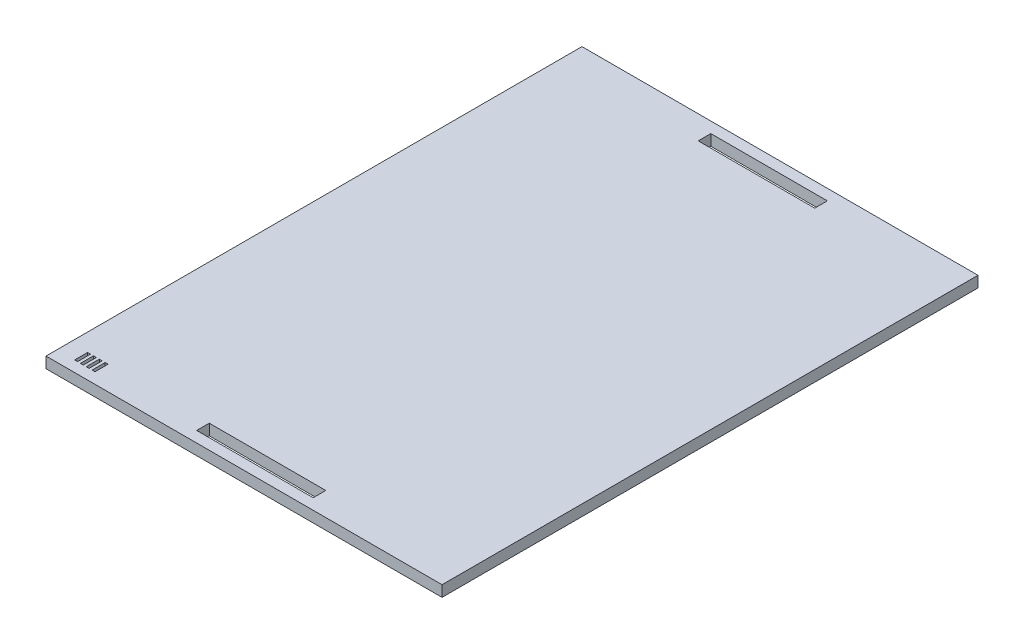
ISO-10303-21;
HEADER;
FILE_DESCRIPTION(('STEP AP214'),'2;1');
FILE_NAME('part.step','',(''),(''),'','','');
FILE_SCHEMA(('AUTOMOTIVE_DESIGN { 1 0 10303 214 1 1 1 1 }'));
ENDSEC;
DATA;
#1=APPLICATION_CONTEXT('core data for automotive mechanical design processes');
#2=APPLICATION_PROTOCOL_DEFINITION('international standard','automotive_design',2000,#1);
#3=PRODUCT_CONTEXT('',#1,'mechanical');
#4=PRODUCT('Part','Part','',(#3));
#5=PRODUCT_RELATED_PRODUCT_CATEGORY('part','',(#4));
#6=PRODUCT_DEFINITION_FORMATION('','',#4);
#7=PRODUCT_DEFINITION_CONTEXT('part definition',#1,'design');
#8=PRODUCT_DEFINITION('design','',#6,#7);
#9=PRODUCT_DEFINITION_SHAPE('','',#8);
#10=(LENGTH_UNIT() NAMED_UNIT(*) SI_UNIT(.MILLI.,.METRE.));
#11=(NAMED_UNIT(*) PLANE_ANGLE_UNIT() SI_UNIT($,.RADIAN.));
#12=(NAMED_UNIT(*) SI_UNIT($,.STERADIAN.) SOLID_ANGLE_UNIT());
#13=UNCERTAINTY_MEASURE_WITH_UNIT(LENGTH_MEASURE(1.E-05),#10,'distance_accuracy_value','');
#14=(GEOMETRIC_REPRESENTATION_CONTEXT(3) GLOBAL_UNCERTAINTY_ASSIGNED_CONTEXT((#13)) GLOBAL_UNIT_ASSIGNED_CONTEXT((#10,
#11,#12)) REPRESENTATION_CONTEXT('',''));
#15=CARTESIAN_POINT('',(0.,0.,0.));
#16=DIRECTION('',(0.,0.,1.));
#17=DIRECTION('',(1.,0.,0.));
#18=AXIS2_PLACEMENT_3D('',#15,#16,#17);
#19=CARTESIAN_POINT('',(0.,2.9972,66.4972));
#20=DIRECTION('',(0.,0.,-1.));
#21=DIRECTION('',(-1.,0.,0.));
#22=AXIS2_PLACEMENT_3D('',#19,#20,#21);
#23=PLANE('',#22);
#24=DIRECTION('',(1.,0.,0.));
#25=VECTOR('',#24,1.);
#26=CARTESIAN_POINT('',(0.,0.,66.4972));
#27=LINE('',#26,#25);
#28=CARTESIAN_POINT('',(-44.3760396173912,0.,66.4972));
#29=VERTEX_POINT('',#28);
#30=CARTESIAN_POINT('',(-43.5822896173912,0.,66.4972));
#31=VERTEX_POINT('',#30);
#32=EDGE_CURVE('E357',#29,#31,#27,.T.);
#33=ORIENTED_EDGE('',*,*,#32,.T.);
#34=DIRECTION('',(0.,-1.,0.));
#35=VECTOR('',#34,1.);
#36=CARTESIAN_POINT('',(-43.5822896173912,2.9972,66.4972));
#37=LINE('',#36,#35);
#38=CARTESIAN_POINT('',(-43.5822896173912,2.9972,66.4972));
#39=VERTEX_POINT('',#38);
#40=EDGE_CURVE('E11',#39,#31,#37,.T.);
#41=ORIENTED_EDGE('',*,*,#40,.F.);
#42=DIRECTION('',(1.,0.,0.));
#43=VECTOR('',#42,1.);
#44=CARTESIAN_POINT('',(0.,2.9972,66.4972));
#45=LINE('',#44,#43);
#46=CARTESIAN_POINT('',(-44.3760396173912,2.9972,66.4972));
#47=VERTEX_POINT('',#46);
#48=EDGE_CURVE('E241',#47,#39,#45,.T.);
#49=ORIENTED_EDGE('',*,*,#48,.F.);
#50=DIRECTION('',(0.,-1.,0.));
#51=VECTOR('',#50,1.);
#52=CARTESIAN_POINT('',(-44.3760396173912,2.9972,66.4972));
#53=LINE('',#52,#51);
#54=EDGE_CURVE('E61',#47,#29,#53,.T.);
#55=ORIENTED_EDGE('',*,*,#54,.T.);
#56=EDGE_LOOP('',(#33,#41,#49,#55));
#57=FACE_BOUND('',#56,.T.);
#58=ADVANCED_FACE('F41',(#57),#23,.F.);
#59=CARTESIAN_POINT('',(-43.5822896173912,2.9972,0.));
#60=DIRECTION('',(1.,0.,0.));
#61=DIRECTION('',(0.,0.,-1.));
#62=AXIS2_PLACEMENT_3D('',#59,#60,#61);
#63=PLANE('',#62);
#64=DIRECTION('',(0.,0.,1.));
#65=VECTOR('',#64,1.);
#66=CARTESIAN_POINT('',(-43.5822896173912,0.,0.));
#67=LINE('',#66,#65);
#68=CARTESIAN_POINT('',(-43.5822896173912,0.,70.0532));
#69=VERTEX_POINT('',#68);
#70=EDGE_CURVE('E248',#31,#69,#67,.T.);
#71=ORIENTED_EDGE('',*,*,#70,.T.);
#72=DIRECTION('',(0.,-1.,0.));
#73=VECTOR('',#72,1.);
#74=CARTESIAN_POINT('',(-43.5822896173912,2.9972,70.0532));
#75=LINE('',#74,#73);
#76=CARTESIAN_POINT('',(-43.5822896173912,2.9972,70.0532));
#77=VERTEX_POINT('',#76);
#78=EDGE_CURVE('E52',#77,#69,#75,.T.);
#79=ORIENTED_EDGE('',*,*,#78,.F.);
#80=DIRECTION('',(0.,0.,1.));
#81=VECTOR('',#80,1.);
#82=CARTESIAN_POINT('',(-43.5822896173912,2.9972,0.));
#83=LINE('',#82,#81);
#84=EDGE_CURVE('E235',#39,#77,#83,.T.);
#85=ORIENTED_EDGE('',*,*,#84,.F.);
#86=ORIENTED_EDGE('',*,*,#40,.T.);
#87=EDGE_LOOP('',(#71,#79,#85,#86));
#88=FACE_BOUND('',#87,.T.);
#89=ADVANCED_FACE('F247',(#88),#63,.F.);
#90=CARTESIAN_POINT('',(0.,2.9972,70.0532));
#91=DIRECTION('',(0.,0.,-1.));
#92=DIRECTION('',(-1.,0.,0.));
#93=AXIS2_PLACEMENT_3D('',#90,#91,#92);
#94=PLANE('',#93);
#95=DIRECTION('',(1.,0.,0.));
#96=VECTOR('',#95,1.);
#97=CARTESIAN_POINT('',(0.,0.,70.0532));
#98=LINE('',#97,#96);
#99=CARTESIAN_POINT('',(-44.3760396173912,0.,70.0532));
#100=VERTEX_POINT('',#99);
#101=EDGE_CURVE('E362',#100,#69,#98,.T.);
#102=ORIENTED_EDGE('',*,*,#101,.F.);
#103=DIRECTION('',(0.,-1.,0.));
#104=VECTOR('',#103,1.);
#105=CARTESIAN_POINT('',(-44.3760396173912,2.9972,70.0532));
#106=LINE('',#105,#104);
#107=CARTESIAN_POINT('',(-44.3760396173912,2.9972,70.0532));
#108=VERTEX_POINT('',#107);
#109=EDGE_CURVE('E147',#108,#100,#106,.T.);
#110=ORIENTED_EDGE('',*,*,#109,.F.);
#111=DIRECTION('',(1.,0.,0.));
#112=VECTOR('',#111,1.);
#113=CARTESIAN_POINT('',(0.,2.9972,70.0532));
#114=LINE('',#113,#112);
#115=EDGE_CURVE('E240',#108,#77,#114,.T.);
#116=ORIENTED_EDGE('',*,*,#115,.T.);
#117=ORIENTED_EDGE('',*,*,#78,.T.);
#118=EDGE_LOOP('',(#102,#110,#116,#117));
#119=FACE_BOUND('',#118,.T.);
#120=ADVANCED_FACE('F253',(#119),#94,.T.);
#121=CARTESIAN_POINT('',(0.,2.9972,66.4972));
#122=DIRECTION('',(0.,0.,-1.));
#123=DIRECTION('',(-1.,0.,0.));
#124=AXIS2_PLACEMENT_3D('',#121,#122,#123);
#125=PLANE('',#124);
#126=DIRECTION('',(1.,0.,0.));
#127=VECTOR('',#126,1.);
#128=CARTESIAN_POINT('',(0.,0.,66.4972));
#129=LINE('',#128,#127);
#130=CARTESIAN_POINT('',(-45.9635396173912,0.,66.4972));
#131=VERTEX_POINT('',#130);
#132=CARTESIAN_POINT('',(-45.1697896173912,0.,66.4972));
#133=VERTEX_POINT('',#132);
#134=EDGE_CURVE('E341',#131,#133,#129,.T.);
#135=ORIENTED_EDGE('',*,*,#134,.T.);
#136=DIRECTION('',(0.,-1.,0.));
#137=VECTOR('',#136,1.);
#138=CARTESIAN_POINT('',(-45.1697896173912,2.9972,66.4972));
#139=LINE('',#138,#137);
#140=CARTESIAN_POINT('',(-45.1697896173912,2.9972,66.4972));
#141=VERTEX_POINT('',#140);
#142=EDGE_CURVE('E372',#141,#133,#139,.T.);
#143=ORIENTED_EDGE('',*,*,#142,.F.);
#144=DIRECTION('',(1.,0.,0.));
#145=VECTOR('',#144,1.);
#146=CARTESIAN_POINT('',(0.,2.9972,66.4972));
#147=LINE('',#146,#145);
#148=CARTESIAN_POINT('',(-45.9635396173912,2.9972,66.4972));
#149=VERTEX_POINT('',#148);
#150=EDGE_CURVE('E535',#149,#141,#147,.T.);
#151=ORIENTED_EDGE('',*,*,#150,.F.);
#152=DIRECTION('',(0.,-1.,0.));
#153=VECTOR('',#152,1.);
#154=CARTESIAN_POINT('',(-45.9635396173912,2.9972,66.4972));
#155=LINE('',#154,#153);
#156=EDGE_CURVE('E375',#149,#131,#155,.T.);
#157=ORIENTED_EDGE('',*,*,#156,.T.);
#158=EDGE_LOOP('',(#135,#143,#151,#157));
#159=FACE_BOUND('',#158,.T.);
#160=ADVANCED_FACE('F566',(#159),#125,.F.);
#161=CARTESIAN_POINT('',(-45.1697896173912,2.9972,0.));
#162=DIRECTION('',(1.,0.,0.));
#163=DIRECTION('',(0.,0.,-1.));
#164=AXIS2_PLACEMENT_3D('',#161,#162,#163);
#165=PLANE('',#164);
#166=DIRECTION('',(0.,0.,1.));
#167=VECTOR('',#166,1.);
#168=CARTESIAN_POINT('',(-45.1697896173912,0.,0.));
#169=LINE('',#168,#167);
#170=CARTESIAN_POINT('',(-45.1697896173912,0.,70.0532));
#171=VERTEX_POINT('',#170);
#172=EDGE_CURVE('E345',#133,#171,#169,.T.);
#173=ORIENTED_EDGE('',*,*,#172,.T.);
#174=DIRECTION('',(0.,-1.,0.));
#175=VECTOR('',#174,1.);
#176=CARTESIAN_POINT('',(-45.1697896173912,2.9972,70.0532));
#177=LINE('',#176,#175);
#178=CARTESIAN_POINT('',(-45.1697896173912,2.9972,70.0532));
#179=VERTEX_POINT('',#178);
#180=EDGE_CURVE('E382',#179,#171,#177,.T.);
#181=ORIENTED_EDGE('',*,*,#180,.F.);
#182=DIRECTION('',(0.,0.,1.));
#183=VECTOR('',#182,1.);
#184=CARTESIAN_POINT('',(-45.1697896173912,2.9972,0.));
#185=LINE('',#184,#183);
#186=EDGE_CURVE('E539',#141,#179,#185,.T.);
#187=ORIENTED_EDGE('',*,*,#186,.F.);
#188=ORIENTED_EDGE('',*,*,#142,.T.);
#189=EDGE_LOOP('',(#173,#181,#187,#188));
#190=FACE_BOUND('',#189,.T.);
#191=ADVANCED_FACE('F568',(#190),#165,.F.);
#192=CARTESIAN_POINT('',(0.,2.9972,70.0532));
#193=DIRECTION('',(0.,0.,-1.));
#194=DIRECTION('',(-1.,0.,0.));
#195=AXIS2_PLACEMENT_3D('',#192,#193,#194);
#196=PLANE('',#195);
#197=DIRECTION('',(1.,0.,0.));
#198=VECTOR('',#197,1.);
#199=CARTESIAN_POINT('',(0.,0.,70.0532));
#200=LINE('',#199,#198);
#201=CARTESIAN_POINT('',(-45.9635396173912,0.,70.0532));
#202=VERTEX_POINT('',#201);
#203=EDGE_CURVE('E349',#202,#171,#200,.T.);
#204=ORIENTED_EDGE('',*,*,#203,.F.);
#205=DIRECTION('',(0.,-1.,0.));
#206=VECTOR('',#205,1.);
#207=CARTESIAN_POINT('',(-45.9635396173912,2.9972,70.0532));
#208=LINE('',#207,#206);
#209=CARTESIAN_POINT('',(-45.9635396173912,2.9972,70.0532));
#210=VERTEX_POINT('',#209);
#211=EDGE_CURVE('E378',#210,#202,#208,.T.);
#212=ORIENTED_EDGE('',*,*,#211,.F.);
#213=DIRECTION('',(1.,0.,0.));
#214=VECTOR('',#213,1.);
#215=CARTESIAN_POINT('',(0.,2.9972,70.0532));
#216=LINE('',#215,#214);
#217=EDGE_CURVE('E542',#210,#179,#216,.T.);
#218=ORIENTED_EDGE('',*,*,#217,.T.);
#219=ORIENTED_EDGE('',*,*,#180,.T.);
#220=EDGE_LOOP('',(#204,#212,#218,#219));
#221=FACE_BOUND('',#220,.T.);
#222=ADVANCED_FACE('F561',(#221),#196,.T.);
#223=CARTESIAN_POINT('',(0.,2.9972,66.4972));
#224=DIRECTION('',(0.,0.,-1.));
#225=DIRECTION('',(-1.,0.,0.));
#226=AXIS2_PLACEMENT_3D('',#223,#224,#225);
#227=PLANE('',#226);
#228=DIRECTION('',(1.,0.,0.));
#229=VECTOR('',#228,1.);
#230=CARTESIAN_POINT('',(0.,0.,66.4972));
#231=LINE('',#230,#229);
#232=CARTESIAN_POINT('',(-49.1385396173912,0.,66.4972));
#233=VERTEX_POINT('',#232);
#234=CARTESIAN_POINT('',(-48.3447896173912,0.,66.4972));
#235=VERTEX_POINT('',#234);
#236=EDGE_CURVE('E325',#233,#235,#231,.T.);
#237=ORIENTED_EDGE('',*,*,#236,.T.);
#238=DIRECTION('',(0.,-1.,0.));
#239=VECTOR('',#238,1.);
#240=CARTESIAN_POINT('',(-48.3447896173912,2.9972,66.4972));
#241=LINE('',#240,#239);
#242=CARTESIAN_POINT('',(-48.3447896173912,2.9972,66.4972));
#243=VERTEX_POINT('',#242);
#244=EDGE_CURVE('E379',#243,#235,#241,.T.);
#245=ORIENTED_EDGE('',*,*,#244,.F.);
#246=DIRECTION('',(1.,0.,0.));
#247=VECTOR('',#246,1.);
#248=CARTESIAN_POINT('',(0.,2.9972,66.4972));
#249=LINE('',#248,#247);
#250=CARTESIAN_POINT('',(-49.1385396173912,2.9972,66.4972));
#251=VERTEX_POINT('',#250);
#252=EDGE_CURVE('E520',#251,#243,#249,.T.);
#253=ORIENTED_EDGE('',*,*,#252,.F.);
#254=DIRECTION('',(0.,-1.,0.));
#255=VECTOR('',#254,1.);
#256=CARTESIAN_POINT('',(-49.1385396173912,2.9972,66.4972));
#257=LINE('',#256,#255);
#258=EDGE_CURVE('E388',#251,#233,#257,.T.);
#259=ORIENTED_EDGE('',*,*,#258,.T.);
#260=EDGE_LOOP('',(#237,#245,#253,#259));
#261=FACE_BOUND('',#260,.T.);
#262=ADVANCED_FACE('F575',(#261),#227,.F.);
#263=CARTESIAN_POINT('',(-48.3447896173912,2.9972,0.));
#264=DIRECTION('',(1.,0.,0.));
#265=DIRECTION('',(0.,0.,-1.));
#266=AXIS2_PLACEMENT_3D('',#263,#264,#265);
#267=PLANE('',#266);
#268=DIRECTION('',(0.,0.,1.));
#269=VECTOR('',#268,1.);
#270=CARTESIAN_POINT('',(-48.3447896173912,0.,0.));
#271=LINE('',#270,#269);
#272=CARTESIAN_POINT('',(-48.3447896173912,0.,70.0532));
#273=VERTEX_POINT('',#272);
#274=EDGE_CURVE('E329',#235,#273,#271,.T.);
#275=ORIENTED_EDGE('',*,*,#274,.T.);
#276=DIRECTION('',(0.,-1.,0.));
#277=VECTOR('',#276,1.);
#278=CARTESIAN_POINT('',(-48.3447896173912,2.9972,70.0532));
#279=LINE('',#278,#277);
#280=CARTESIAN_POINT('',(-48.3447896173912,2.9972,70.0532));
#281=VERTEX_POINT('',#280);
#282=EDGE_CURVE('E395',#281,#273,#279,.T.);
#283=ORIENTED_EDGE('',*,*,#282,.F.);
#284=DIRECTION('',(0.,0.,1.));
#285=VECTOR('',#284,1.);
#286=CARTESIAN_POINT('',(-48.3447896173912,2.9972,0.));
#287=LINE('',#286,#285);
#288=EDGE_CURVE('E524',#243,#281,#287,.T.);
#289=ORIENTED_EDGE('',*,*,#288,.F.);
#290=ORIENTED_EDGE('',*,*,#244,.T.);
#291=EDGE_LOOP('',(#275,#283,#289,#290));
#292=FACE_BOUND('',#291,.T.);
#293=ADVANCED_FACE('F653',(#292),#267,.F.);
#294=CARTESIAN_POINT('',(0.,2.9972,70.0532));
#295=DIRECTION('',(0.,0.,-1.));
#296=DIRECTION('',(-1.,0.,0.));
#297=AXIS2_PLACEMENT_3D('',#294,#295,#296);
#298=PLANE('',#297);
#299=DIRECTION('',(1.,0.,0.));
#300=VECTOR('',#299,1.);
#301=CARTESIAN_POINT('',(0.,0.,70.0532));
#302=LINE('',#301,#300);
#303=CARTESIAN_POINT('',(-49.1385396173912,0.,70.0532));
#304=VERTEX_POINT('',#303);
#305=EDGE_CURVE('E333',#304,#273,#302,.T.);
#306=ORIENTED_EDGE('',*,*,#305,.F.);
#307=DIRECTION('',(0.,-1.,0.));
#308=VECTOR('',#307,1.);
#309=CARTESIAN_POINT('',(-49.1385396173912,2.9972,70.0532));
#310=LINE('',#309,#308);
#311=CARTESIAN_POINT('',(-49.1385396173912,2.9972,70.0532));
#312=VERTEX_POINT('',#311);
#313=EDGE_CURVE('E391',#312,#304,#310,.T.);
#314=ORIENTED_EDGE('',*,*,#313,.F.);
#315=DIRECTION('',(1.,0.,0.));
#316=VECTOR('',#315,1.);
#317=CARTESIAN_POINT('',(0.,2.9972,70.0532));
#318=LINE('',#317,#316);
#319=EDGE_CURVE('E527',#312,#281,#318,.T.);
#320=ORIENTED_EDGE('',*,*,#319,.T.);
#321=ORIENTED_EDGE('',*,*,#282,.T.);
#322=EDGE_LOOP('',(#306,#314,#320,#321));
#323=FACE_BOUND('',#322,.T.);
#324=ADVANCED_FACE('F640',(#323),#298,.T.);
#325=CARTESIAN_POINT('',(0.,2.9972,66.6242));
#326=DIRECTION('',(0.,0.,-1.));
#327=DIRECTION('',(-1.,0.,0.));
#328=AXIS2_PLACEMENT_3D('',#325,#326,#327);
#329=PLANE('',#328);
#330=DIRECTION('',(1.,0.,0.));
#331=VECTOR('',#330,1.);
#332=CARTESIAN_POINT('',(0.,0.,66.6242));
#333=LINE('',#332,#331);
#334=CARTESIAN_POINT('',(-15.875,0.,66.6242));
#335=VERTEX_POINT('',#334);
#336=CARTESIAN_POINT('',(15.875,0.,66.6242));
#337=VERTEX_POINT('',#336);
#338=EDGE_CURVE('E309',#335,#337,#333,.T.);
#339=ORIENTED_EDGE('',*,*,#338,.T.);
#340=DIRECTION('',(0.,-1.,0.));
#341=VECTOR('',#340,1.);
#342=CARTESIAN_POINT('',(15.875,2.9972,66.6242));
#343=LINE('',#342,#341);
#344=CARTESIAN_POINT('',(15.875,2.9972,66.6242));
#345=VERTEX_POINT('',#344);
#346=EDGE_CURVE('E392',#345,#337,#343,.T.);
#347=ORIENTED_EDGE('',*,*,#346,.F.);
#348=DIRECTION('',(1.,0.,0.));
#349=VECTOR('',#348,1.);
#350=CARTESIAN_POINT('',(0.,2.9972,66.6242));
#351=LINE('',#350,#349);
#352=CARTESIAN_POINT('',(-15.875,2.9972,66.6242));
#353=VERTEX_POINT('',#352);
#354=EDGE_CURVE('E505',#353,#345,#351,.T.);
#355=ORIENTED_EDGE('',*,*,#354,.F.);
#356=DIRECTION('',(0.,-1.,0.));
#357=VECTOR('',#356,1.);
#358=CARTESIAN_POINT('',(-15.875,2.9972,66.6242));
#359=LINE('',#358,#357);
#360=EDGE_CURVE('E401',#353,#335,#359,.T.);
#361=ORIENTED_EDGE('',*,*,#360,.T.);
#362=EDGE_LOOP('',(#339,#347,#355,#361));
#363=FACE_BOUND('',#362,.T.);
#364=ADVANCED_FACE('F636',(#363),#329,.F.);
#365=CARTESIAN_POINT('',(15.8750000000001,2.9972,0.));
#366=DIRECTION('',(1.,0.,0.));
#367=DIRECTION('',(0.,0.,-1.));
#368=AXIS2_PLACEMENT_3D('',#365,#366,#367);
#369=PLANE('',#368);
#370=DIRECTION('',(0.,0.,1.));
#371=VECTOR('',#370,1.);
#372=CARTESIAN_POINT('',(15.8750000000001,0.,0.));
#373=LINE('',#372,#371);
#374=CARTESIAN_POINT('',(15.875,0.,70.0532));
#375=VERTEX_POINT('',#374);
#376=EDGE_CURVE('E313',#337,#375,#373,.T.);
#377=ORIENTED_EDGE('',*,*,#376,.T.);
#378=DIRECTION('',(0.,-1.,0.));
#379=VECTOR('',#378,1.);
#380=CARTESIAN_POINT('',(15.875,2.9972,70.0532));
#381=LINE('',#380,#379);
#382=CARTESIAN_POINT('',(15.875,2.9972,70.0532));
#383=VERTEX_POINT('',#382);
#384=EDGE_CURVE('E408',#383,#375,#381,.T.);
#385=ORIENTED_EDGE('',*,*,#384,.F.);
#386=DIRECTION('',(0.,0.,1.));
#387=VECTOR('',#386,1.);
#388=CARTESIAN_POINT('',(15.8750000000001,2.9972,0.));
#389=LINE('',#388,#387);
#390=EDGE_CURVE('E509',#345,#383,#389,.T.);
#391=ORIENTED_EDGE('',*,*,#390,.F.);
#392=ORIENTED_EDGE('',*,*,#346,.T.);
#393=EDGE_LOOP('',(#377,#385,#391,#392));
#394=FACE_BOUND('',#393,.T.);
#395=ADVANCED_FACE('F639',(#394),#369,.F.);
#396=CARTESIAN_POINT('',(0.,2.9972,70.0532));
#397=DIRECTION('',(0.,0.,-1.));
#398=DIRECTION('',(-1.,0.,0.));
#399=AXIS2_PLACEMENT_3D('',#396,#397,#398);
#400=PLANE('',#399);
#401=DIRECTION('',(1.,0.,0.));
#402=VECTOR('',#401,1.);
#403=CARTESIAN_POINT('',(0.,0.,70.0532));
#404=LINE('',#403,#402);
#405=CARTESIAN_POINT('',(-15.875,0.,70.0532));
#406=VERTEX_POINT('',#405);
#407=EDGE_CURVE('E317',#406,#375,#404,.T.);
#408=ORIENTED_EDGE('',*,*,#407,.F.);
#409=DIRECTION('',(0.,-1.,0.));
#410=VECTOR('',#409,1.);
#411=CARTESIAN_POINT('',(-15.875,2.9972,70.0532));
#412=LINE('',#411,#410);
#413=CARTESIAN_POINT('',(-15.875,2.9972,70.0532));
#414=VERTEX_POINT('',#413);
#415=EDGE_CURVE('E404',#414,#406,#412,.T.);
#416=ORIENTED_EDGE('',*,*,#415,.F.);
#417=DIRECTION('',(1.,0.,0.));
#418=VECTOR('',#417,1.);
#419=CARTESIAN_POINT('',(0.,2.9972,70.0532));
#420=LINE('',#419,#418);
#421=EDGE_CURVE('E512',#414,#383,#420,.T.);
#422=ORIENTED_EDGE('',*,*,#421,.T.);
#423=ORIENTED_EDGE('',*,*,#384,.T.);
#424=EDGE_LOOP('',(#408,#416,#422,#423));
#425=FACE_BOUND('',#424,.T.);
#426=ADVANCED_FACE('F625',(#425),#400,.T.);
#427=CARTESIAN_POINT('',(0.,2.9972,-70.0532));
#428=DIRECTION('',(0.,0.,-1.));
#429=DIRECTION('',(-1.,0.,0.));
#430=AXIS2_PLACEMENT_3D('',#427,#428,#429);
#431=PLANE('',#430);
#432=DIRECTION('',(1.,0.,0.));
#433=VECTOR('',#432,1.);
#434=CARTESIAN_POINT('',(0.,0.,-70.0532));
#435=LINE('',#434,#433);
#436=CARTESIAN_POINT('',(-15.875,0.,-70.0532));
#437=VERTEX_POINT('',#436);
#438=CARTESIAN_POINT('',(15.875,0.,-70.0532));
#439=VERTEX_POINT('',#438);
#440=EDGE_CURVE('E293',#437,#439,#435,.T.);
#441=ORIENTED_EDGE('',*,*,#440,.T.);
#442=DIRECTION('',(0.,-1.,0.));
#443=VECTOR('',#442,1.);
#444=CARTESIAN_POINT('',(15.875,2.9972,-70.0532));
#445=LINE('',#444,#443);
#446=CARTESIAN_POINT('',(15.875,2.9972,-70.0532));
#447=VERTEX_POINT('',#446);
#448=EDGE_CURVE('E405',#447,#439,#445,.T.);
#449=ORIENTED_EDGE('',*,*,#448,.F.);
#450=DIRECTION('',(1.,0.,0.));
#451=VECTOR('',#450,1.);
#452=CARTESIAN_POINT('',(0.,2.9972,-70.0532));
#453=LINE('',#452,#451);
#454=CARTESIAN_POINT('',(-15.875,2.9972,-70.0532));
#455=VERTEX_POINT('',#454);
#456=EDGE_CURVE('E490',#455,#447,#453,.T.);
#457=ORIENTED_EDGE('',*,*,#456,.F.);
#458=DIRECTION('',(0.,-1.,0.));
#459=VECTOR('',#458,1.);
#460=CARTESIAN_POINT('',(-15.875,2.9972,-70.0532));
#461=LINE('',#460,#459);
#462=EDGE_CURVE('E414',#455,#437,#461,.T.);
#463=ORIENTED_EDGE('',*,*,#462,.T.);
#464=EDGE_LOOP('',(#441,#449,#457,#463));
#465=FACE_BOUND('',#464,.T.);
#466=ADVANCED_FACE('F621',(#465),#431,.F.);
#467=CARTESIAN_POINT('',(15.875,2.9972,0.));
#468=DIRECTION('',(1.,0.,0.));
#469=DIRECTION('',(0.,0.,-1.));
#470=AXIS2_PLACEMENT_3D('',#467,#468,#469);
#471=PLANE('',#470);
#472=DIRECTION('',(0.,0.,1.));
#473=VECTOR('',#472,1.);
#474=CARTESIAN_POINT('',(15.875,0.,0.));
#475=LINE('',#474,#473);
#476=CARTESIAN_POINT('',(15.875,0.,-66.6242));
#477=VERTEX_POINT('',#476);
#478=EDGE_CURVE('E297',#439,#477,#475,.T.);
#479=ORIENTED_EDGE('',*,*,#478,.T.);
#480=DIRECTION('',(0.,-1.,0.));
#481=VECTOR('',#480,1.);
#482=CARTESIAN_POINT('',(15.875,2.9972,-66.6242));
#483=LINE('',#482,#481);
#484=CARTESIAN_POINT('',(15.875,2.9972,-66.6242));
#485=VERTEX_POINT('',#484);
#486=EDGE_CURVE('E421',#485,#477,#483,.T.);
#487=ORIENTED_EDGE('',*,*,#486,.F.);
#488=DIRECTION('',(0.,0.,1.));
#489=VECTOR('',#488,1.);
#490=CARTESIAN_POINT('',(15.875,2.9972,0.));
#491=LINE('',#490,#489);
#492=EDGE_CURVE('E494',#447,#485,#491,.T.);
#493=ORIENTED_EDGE('',*,*,#492,.F.);
#494=ORIENTED_EDGE('',*,*,#448,.T.);
#495=EDGE_LOOP('',(#479,#487,#493,#494));
#496=FACE_BOUND('',#495,.T.);
#497=ADVANCED_FACE('F624',(#496),#471,.F.);
#498=CARTESIAN_POINT('',(0.,2.9972,-66.6242));
#499=DIRECTION('',(0.,0.,-1.));
#500=DIRECTION('',(-1.,0.,0.));
#501=AXIS2_PLACEMENT_3D('',#498,#499,#500);
#502=PLANE('',#501);
#503=DIRECTION('',(1.,0.,0.));
#504=VECTOR('',#503,1.);
#505=CARTESIAN_POINT('',(0.,0.,-66.6242));
#506=LINE('',#505,#504);
#507=CARTESIAN_POINT('',(-15.875,0.,-66.6242));
#508=VERTEX_POINT('',#507);
#509=EDGE_CURVE('E301',#508,#477,#506,.T.);
#510=ORIENTED_EDGE('',*,*,#509,.F.);
#511=DIRECTION('',(0.,-1.,0.));
#512=VECTOR('',#511,1.);
#513=CARTESIAN_POINT('',(-15.875,2.9972,-66.6242));
#514=LINE('',#513,#512);
#515=CARTESIAN_POINT('',(-15.875,2.9972,-66.6242));
#516=VERTEX_POINT('',#515);
#517=EDGE_CURVE('E417',#516,#508,#514,.T.);
#518=ORIENTED_EDGE('',*,*,#517,.F.);
#519=DIRECTION('',(1.,0.,0.));
#520=VECTOR('',#519,1.);
#521=CARTESIAN_POINT('',(0.,2.9972,-66.6242));
#522=LINE('',#521,#520);
#523=EDGE_CURVE('E497',#516,#485,#522,.T.);
#524=ORIENTED_EDGE('',*,*,#523,.T.);
#525=ORIENTED_EDGE('',*,*,#486,.T.);
#526=EDGE_LOOP('',(#510,#518,#524,#525));
#527=FACE_BOUND('',#526,.T.);
#528=ADVANCED_FACE('F608',(#527),#502,.T.);
#529=CARTESIAN_POINT('',(-53.9622999999999,2.9972,0.));
#530=DIRECTION('',(-1.,0.,0.));
#531=DIRECTION('',(0.,0.,1.));
#532=AXIS2_PLACEMENT_3D('',#529,#530,#531);
#533=PLANE('',#532);
#534=DIRECTION('',(0.,0.,-1.));
#535=VECTOR('',#534,1.);
#536=CARTESIAN_POINT('',(-53.9622999999999,0.,0.));
#537=LINE('',#536,#535);
#538=CARTESIAN_POINT('',(-53.9622999999999,0.,73.025));
#539=VERTEX_POINT('',#538);
#540=CARTESIAN_POINT('',(-53.9622999999999,0.,-73.025));
#541=VERTEX_POINT('',#540);
#542=EDGE_CURVE('E277',#539,#541,#537,.T.);
#543=ORIENTED_EDGE('',*,*,#542,.F.);
#544=DIRECTION('',(0.,-1.,0.));
#545=VECTOR('',#544,1.);
#546=CARTESIAN_POINT('',(-53.9622999999999,2.9972,73.025));
#547=LINE('',#546,#545);
#548=CARTESIAN_POINT('',(-53.9622999999999,2.9972,73.025));
#549=VERTEX_POINT('',#548);
#550=EDGE_CURVE('E418',#549,#539,#547,.T.);
#551=ORIENTED_EDGE('',*,*,#550,.F.);
#552=DIRECTION('',(0.,0.,-1.));
#553=VECTOR('',#552,1.);
#554=CARTESIAN_POINT('',(-53.9622999999999,2.9972,0.));
#555=LINE('',#554,#553);
#556=CARTESIAN_POINT('',(-53.9622999999999,2.9972,-73.025));
#557=VERTEX_POINT('',#556);
#558=EDGE_CURVE('E469',#549,#557,#555,.T.);
#559=ORIENTED_EDGE('',*,*,#558,.T.);
#560=DIRECTION('',(0.,-1.,0.));
#561=VECTOR('',#560,1.);
#562=CARTESIAN_POINT('',(-53.9622999999999,2.9972,-73.025));
#563=LINE('',#562,#561);
#564=EDGE_CURVE('E427',#557,#541,#563,.T.);
#565=ORIENTED_EDGE('',*,*,#564,.T.);
#566=EDGE_LOOP('',(#543,#551,#559,#565));
#567=FACE_BOUND('',#566,.T.);
#568=ADVANCED_FACE('F604',(#567),#533,.T.);
#569=CARTESIAN_POINT('',(0.,2.9972,73.025));
#570=DIRECTION('',(0.,0.,1.));
#571=DIRECTION('',(1.,0.,0.));
#572=AXIS2_PLACEMENT_3D('',#569,#570,#571);
#573=PLANE('',#572);
#574=DIRECTION('',(-1.,0.,0.));
#575=VECTOR('',#574,1.);
#576=CARTESIAN_POINT('',(0.,0.,73.025));
#577=LINE('',#576,#575);
#578=CARTESIAN_POINT('',(53.9623000000001,0.,73.025));
#579=VERTEX_POINT('',#578);
#580=EDGE_CURVE('E281',#579,#539,#577,.T.);
#581=ORIENTED_EDGE('',*,*,#580,.F.);
#582=DIRECTION('',(0.,-1.,0.));
#583=VECTOR('',#582,1.);
#584=CARTESIAN_POINT('',(53.9623000000001,2.9972,73.025));
#585=LINE('',#584,#583);
#586=CARTESIAN_POINT('',(53.9623000000001,2.9972,73.025));
#587=VERTEX_POINT('',#586);
#588=EDGE_CURVE('E434',#587,#579,#585,.T.);
#589=ORIENTED_EDGE('',*,*,#588,.F.);
#590=DIRECTION('',(-1.,0.,0.));
#591=VECTOR('',#590,1.);
#592=CARTESIAN_POINT('',(0.,2.9972,73.025));
#593=LINE('',#592,#591);
#594=EDGE_CURVE('E475',#587,#549,#593,.T.);
#595=ORIENTED_EDGE('',*,*,#594,.T.);
#596=ORIENTED_EDGE('',*,*,#550,.T.);
#597=EDGE_LOOP('',(#581,#589,#595,#596));
#598=FACE_BOUND('',#597,.T.);
#599=ADVANCED_FACE('F607',(#598),#573,.T.);
#600=CARTESIAN_POINT('',(53.9623000000001,2.9972,0.));
#601=DIRECTION('',(-1.,0.,0.));
#602=DIRECTION('',(0.,0.,1.));
#603=AXIS2_PLACEMENT_3D('',#600,#601,#602);
#604=PLANE('',#603);
#605=DIRECTION('',(0.,0.,-1.));
#606=VECTOR('',#605,1.);
#607=CARTESIAN_POINT('',(53.9623000000001,0.,0.));
#608=LINE('',#607,#606);
#609=CARTESIAN_POINT('',(53.9623000000001,0.,-73.025));
#610=VERTEX_POINT('',#609);
#611=EDGE_CURVE('E285',#579,#610,#608,.T.);
#612=ORIENTED_EDGE('',*,*,#611,.T.);
#613=DIRECTION('',(0.,-1.,0.));
#614=VECTOR('',#613,1.);
#615=CARTESIAN_POINT('',(53.9623000000001,2.9972,-73.025));
#616=LINE('',#615,#614);
#617=CARTESIAN_POINT('',(53.9623000000001,2.9972,-73.025));
#618=VERTEX_POINT('',#617);
#619=EDGE_CURVE('E430',#618,#610,#616,.T.);
#620=ORIENTED_EDGE('',*,*,#619,.F.);
#621=DIRECTION('',(0.,0.,-1.));
#622=VECTOR('',#621,1.);
#623=CARTESIAN_POINT('',(53.9623000000001,2.9972,0.));
#624=LINE('',#623,#622);
#625=EDGE_CURVE('E483',#587,#618,#624,.T.);
#626=ORIENTED_EDGE('',*,*,#625,.F.);
#627=ORIENTED_EDGE('',*,*,#588,.T.);
#628=EDGE_LOOP('',(#612,#620,#626,#627));
#629=FACE_BOUND('',#628,.T.);
#630=ADVANCED_FACE('F612',(#629),#604,.F.);
#631=CARTESIAN_POINT('',(-46.7572896173912,2.9972,0.));
#632=DIRECTION('',(-1.,0.,0.));
#633=DIRECTION('',(0.,0.,1.));
#634=AXIS2_PLACEMENT_3D('',#631,#632,#633);
#635=PLANE('',#634);
#636=DIRECTION('',(0.,0.,-1.));
#637=VECTOR('',#636,1.);
#638=CARTESIAN_POINT('',(-46.7572896173912,0.,0.));
#639=LINE('',#638,#637);
#640=CARTESIAN_POINT('',(-46.7572896173912,0.,70.0532));
#641=VERTEX_POINT('',#640);
#642=CARTESIAN_POINT('',(-46.7572896173912,0.,66.4972));
#643=VERTEX_POINT('',#642);
#644=EDGE_CURVE('E262',#641,#643,#639,.T.);
#645=ORIENTED_EDGE('',*,*,#644,.F.);
#646=DIRECTION('',(0.,-1.,0.));
#647=VECTOR('',#646,1.);
#648=CARTESIAN_POINT('',(-46.7572896173912,2.9972,70.0532));
#649=LINE('',#648,#647);
#650=CARTESIAN_POINT('',(-46.7572896173912,2.9972,70.0532));
#651=VERTEX_POINT('',#650);
#652=EDGE_CURVE('E45',#651,#641,#649,.T.);
#653=ORIENTED_EDGE('',*,*,#652,.F.);
#654=DIRECTION('',(0.,0.,-1.));
#655=VECTOR('',#654,1.);
#656=CARTESIAN_POINT('',(-46.7572896173912,2.9972,0.));
#657=LINE('',#656,#655);
#658=CARTESIAN_POINT('',(-46.7572896173912,2.9972,66.4972));
#659=VERTEX_POINT('',#658);
#660=EDGE_CURVE('E369',#651,#659,#657,.T.);
#661=ORIENTED_EDGE('',*,*,#660,.T.);
#662=DIRECTION('',(0.,-1.,0.));
#663=VECTOR('',#662,1.);
#664=CARTESIAN_POINT('',(-46.7572896173912,2.9972,66.4972));
#665=LINE('',#664,#663);
#666=EDGE_CURVE('E258',#659,#643,#665,.T.);
#667=ORIENTED_EDGE('',*,*,#666,.T.);
#668=EDGE_LOOP('',(#645,#653,#661,#667));
#669=FACE_BOUND('',#668,.T.);
#670=ADVANCED_FACE('F43',(#669),#635,.T.);
#671=CARTESIAN_POINT('',(0.,2.9972,70.0532));
#672=DIRECTION('',(0.,0.,-1.));
#673=DIRECTION('',(-1.,0.,0.));
#674=AXIS2_PLACEMENT_3D('',#671,#672,#673);
#675=PLANE('',#674);
#676=DIRECTION('',(1.,0.,0.));
#677=VECTOR('',#676,1.);
#678=CARTESIAN_POINT('',(0.,0.,70.0532));
#679=LINE('',#678,#677);
#680=CARTESIAN_POINT('',(-47.5510396173912,0.,70.0532));
#681=VERTEX_POINT('',#680);
#682=EDGE_CURVE('E266',#681,#641,#679,.T.);
#683=ORIENTED_EDGE('',*,*,#682,.F.);
#684=DIRECTION('',(0.,-1.,0.));
#685=VECTOR('',#684,1.);
#686=CARTESIAN_POINT('',(-47.5510396173912,2.9972,70.0532));
#687=LINE('',#686,#685);
#688=CARTESIAN_POINT('',(-47.5510396173912,2.9972,70.0532));
#689=VERTEX_POINT('',#688);
#690=EDGE_CURVE('E444',#689,#681,#687,.T.);
#691=ORIENTED_EDGE('',*,*,#690,.F.);
#692=DIRECTION('',(1.,0.,0.));
#693=VECTOR('',#692,1.);
#694=CARTESIAN_POINT('',(0.,2.9972,70.0532));
#695=LINE('',#694,#693);
#696=EDGE_CURVE('E455',#689,#651,#695,.T.);
#697=ORIENTED_EDGE('',*,*,#696,.T.);
#698=ORIENTED_EDGE('',*,*,#652,.T.);
#699=EDGE_LOOP('',(#683,#691,#697,#698));
#700=FACE_BOUND('',#699,.T.);
#701=ADVANCED_FACE('F453',(#700),#675,.T.);
#702=CARTESIAN_POINT('',(-47.5510396173912,2.9972,0.));
#703=DIRECTION('',(-1.,0.,0.));
#704=DIRECTION('',(0.,0.,1.));
#705=AXIS2_PLACEMENT_3D('',#702,#703,#704);
#706=PLANE('',#705);
#707=DIRECTION('',(0.,0.,-1.));
#708=VECTOR('',#707,1.);
#709=CARTESIAN_POINT('',(-47.5510396173912,0.,0.));
#710=LINE('',#709,#708);
#711=CARTESIAN_POINT('',(-47.5510396173912,0.,66.4972));
#712=VERTEX_POINT('',#711);
#713=EDGE_CURVE('E270',#681,#712,#710,.T.);
#714=ORIENTED_EDGE('',*,*,#713,.T.);
#715=DIRECTION('',(0.,-1.,0.));
#716=VECTOR('',#715,1.);
#717=CARTESIAN_POINT('',(-47.5510396173912,2.9972,66.4972));
#718=LINE('',#717,#716);
#719=CARTESIAN_POINT('',(-47.5510396173912,2.9972,66.4972));
#720=VERTEX_POINT('',#719);
#721=EDGE_CURVE('E441',#720,#712,#718,.T.);
#722=ORIENTED_EDGE('',*,*,#721,.F.);
#723=DIRECTION('',(0.,0.,-1.));
#724=VECTOR('',#723,1.);
#725=CARTESIAN_POINT('',(-47.5510396173912,2.9972,0.));
#726=LINE('',#725,#724);
#727=EDGE_CURVE('E470',#689,#720,#726,.T.);
#728=ORIENTED_EDGE('',*,*,#727,.F.);
#729=ORIENTED_EDGE('',*,*,#690,.T.);
#730=EDGE_LOOP('',(#714,#722,#728,#729));
#731=FACE_BOUND('',#730,.T.);
#732=ADVANCED_FACE('F462',(#731),#706,.F.);
#733=CARTESIAN_POINT('',(-45.9635396173912,2.9972,0.));
#734=DIRECTION('',(1.,0.,0.));
#735=DIRECTION('',(0.,0.,-1.));
#736=AXIS2_PLACEMENT_3D('',#733,#734,#735);
#737=PLANE('',#736);
#738=DIRECTION('',(0.,0.,1.));
#739=VECTOR('',#738,1.);
#740=CARTESIAN_POINT('',(-45.9635396173912,0.,0.));
#741=LINE('',#740,#739);
#742=EDGE_CURVE('E353',#131,#202,#741,.T.);
#743=ORIENTED_EDGE('',*,*,#742,.F.);
#744=ORIENTED_EDGE('',*,*,#156,.F.);
#745=DIRECTION('',(0.,0.,1.));
#746=VECTOR('',#745,1.);
#747=CARTESIAN_POINT('',(-45.9635396173912,2.9972,0.));
#748=LINE('',#747,#746);
#749=EDGE_CURVE('E546',#149,#210,#748,.T.);
#750=ORIENTED_EDGE('',*,*,#749,.T.);
#751=ORIENTED_EDGE('',*,*,#211,.T.);
#752=EDGE_LOOP('',(#743,#744,#750,#751));
#753=FACE_BOUND('',#752,.T.);
#754=ADVANCED_FACE('F553',(#753),#737,.T.);
#755=CARTESIAN_POINT('',(-49.1385396173912,2.9972,0.));
#756=DIRECTION('',(1.,0.,0.));
#757=DIRECTION('',(0.,0.,-1.));
#758=AXIS2_PLACEMENT_3D('',#755,#756,#757);
#759=PLANE('',#758);
#760=DIRECTION('',(0.,0.,1.));
#761=VECTOR('',#760,1.);
#762=CARTESIAN_POINT('',(-49.1385396173912,0.,0.));
#763=LINE('',#762,#761);
#764=EDGE_CURVE('E337',#233,#304,#763,.T.);
#765=ORIENTED_EDGE('',*,*,#764,.F.);
#766=ORIENTED_EDGE('',*,*,#258,.F.);
#767=DIRECTION('',(0.,0.,1.));
#768=VECTOR('',#767,1.);
#769=CARTESIAN_POINT('',(-49.1385396173912,2.9972,0.));
#770=LINE('',#769,#768);
#771=EDGE_CURVE('E531',#251,#312,#770,.T.);
#772=ORIENTED_EDGE('',*,*,#771,.T.);
#773=ORIENTED_EDGE('',*,*,#313,.T.);
#774=EDGE_LOOP('',(#765,#766,#772,#773));
#775=FACE_BOUND('',#774,.T.);
#776=ADVANCED_FACE('F587',(#775),#759,.T.);
#777=CARTESIAN_POINT('',(-15.8750000000001,2.9972,0.));
#778=DIRECTION('',(1.,0.,0.));
#779=DIRECTION('',(0.,0.,-1.));
#780=AXIS2_PLACEMENT_3D('',#777,#778,#779);
#781=PLANE('',#780);
#782=DIRECTION('',(0.,0.,1.));
#783=VECTOR('',#782,1.);
#784=CARTESIAN_POINT('',(-15.8750000000001,0.,0.));
#785=LINE('',#784,#783);
#786=EDGE_CURVE('E321',#335,#406,#785,.T.);
#787=ORIENTED_EDGE('',*,*,#786,.F.);
#788=ORIENTED_EDGE('',*,*,#360,.F.);
#789=DIRECTION('',(0.,0.,1.));
#790=VECTOR('',#789,1.);
#791=CARTESIAN_POINT('',(-15.8750000000001,2.9972,0.));
#792=LINE('',#791,#790);
#793=EDGE_CURVE('E516',#353,#414,#792,.T.);
#794=ORIENTED_EDGE('',*,*,#793,.T.);
#795=ORIENTED_EDGE('',*,*,#415,.T.);
#796=EDGE_LOOP('',(#787,#788,#794,#795));
#797=FACE_BOUND('',#796,.T.);
#798=ADVANCED_FACE('F592',(#797),#781,.T.);
#799=CARTESIAN_POINT('',(-15.875,2.9972,0.));
#800=DIRECTION('',(1.,0.,0.));
#801=DIRECTION('',(0.,0.,-1.));
#802=AXIS2_PLACEMENT_3D('',#799,#800,#801);
#803=PLANE('',#802);
#804=DIRECTION('',(0.,0.,1.));
#805=VECTOR('',#804,1.);
#806=CARTESIAN_POINT('',(-15.875,0.,0.));
#807=LINE('',#806,#805);
#808=EDGE_CURVE('E305',#437,#508,#807,.T.);
#809=ORIENTED_EDGE('',*,*,#808,.F.);
#810=ORIENTED_EDGE('',*,*,#462,.F.);
#811=DIRECTION('',(0.,0.,1.));
#812=VECTOR('',#811,1.);
#813=CARTESIAN_POINT('',(-15.875,2.9972,0.));
#814=LINE('',#813,#812);
#815=EDGE_CURVE('E501',#455,#516,#814,.T.);
#816=ORIENTED_EDGE('',*,*,#815,.T.);
#817=ORIENTED_EDGE('',*,*,#517,.T.);
#818=EDGE_LOOP('',(#809,#810,#816,#817));
#819=FACE_BOUND('',#818,.T.);
#820=ADVANCED_FACE('F619',(#819),#803,.T.);
#821=CARTESIAN_POINT('',(0.,2.9972,-73.025));
#822=DIRECTION('',(0.,0.,1.));
#823=DIRECTION('',(1.,0.,0.));
#824=AXIS2_PLACEMENT_3D('',#821,#822,#823);
#825=PLANE('',#824);
#826=DIRECTION('',(-1.,0.,0.));
#827=VECTOR('',#826,1.);
#828=CARTESIAN_POINT('',(0.,0.,-73.025));
#829=LINE('',#828,#827);
#830=EDGE_CURVE('E289',#610,#541,#829,.T.);
#831=ORIENTED_EDGE('',*,*,#830,.T.);
#832=ORIENTED_EDGE('',*,*,#564,.F.);
#833=DIRECTION('',(-1.,0.,0.));
#834=VECTOR('',#833,1.);
#835=CARTESIAN_POINT('',(0.,2.9972,-73.025));
#836=LINE('',#835,#834);
#837=EDGE_CURVE('E487',#618,#557,#836,.T.);
#838=ORIENTED_EDGE('',*,*,#837,.F.);
#839=ORIENTED_EDGE('',*,*,#619,.T.);
#840=EDGE_LOOP('',(#831,#832,#838,#839));
#841=FACE_BOUND('',#840,.T.);
#842=ADVANCED_FACE('F603',(#841),#825,.F.);
#843=CARTESIAN_POINT('',(0.,2.9972,66.4972));
#844=DIRECTION('',(0.,0.,-1.));
#845=DIRECTION('',(-1.,0.,0.));
#846=AXIS2_PLACEMENT_3D('',#843,#844,#845);
#847=PLANE('',#846);
#848=DIRECTION('',(1.,0.,0.));
#849=VECTOR('',#848,1.);
#850=CARTESIAN_POINT('',(0.,0.,66.4972));
#851=LINE('',#850,#849);
#852=EDGE_CURVE('E273',#712,#643,#851,.T.);
#853=ORIENTED_EDGE('',*,*,#852,.T.);
#854=ORIENTED_EDGE('',*,*,#666,.F.);
#855=DIRECTION('',(1.,0.,0.));
#856=VECTOR('',#855,1.);
#857=CARTESIAN_POINT('',(0.,2.9972,66.4972));
#858=LINE('',#857,#856);
#859=EDGE_CURVE('E466',#720,#659,#858,.T.);
#860=ORIENTED_EDGE('',*,*,#859,.F.);
#861=ORIENTED_EDGE('',*,*,#721,.T.);
#862=EDGE_LOOP('',(#853,#854,#860,#861));
#863=FACE_BOUND('',#862,.T.);
#864=ADVANCED_FACE('F465',(#863),#847,.F.);
#865=CARTESIAN_POINT('',(-44.3760396173912,2.9972,0.));
#866=DIRECTION('',(1.,0.,0.));
#867=DIRECTION('',(0.,0.,-1.));
#868=AXIS2_PLACEMENT_3D('',#865,#866,#867);
#869=PLANE('',#868);
#870=DIRECTION('',(0.,0.,1.));
#871=VECTOR('',#870,1.);
#872=CARTESIAN_POINT('',(-44.3760396173912,0.,0.));
#873=LINE('',#872,#871);
#874=EDGE_CURVE('E365',#29,#100,#873,.T.);
#875=ORIENTED_EDGE('',*,*,#874,.F.);
#876=ORIENTED_EDGE('',*,*,#54,.F.);
#877=DIRECTION('',(0.,0.,1.));
#878=VECTOR('',#877,1.);
#879=CARTESIAN_POINT('',(-44.3760396173912,2.9972,0.));
#880=LINE('',#879,#878);
#881=EDGE_CURVE('E255',#47,#108,#880,.T.);
#882=ORIENTED_EDGE('',*,*,#881,.T.);
#883=ORIENTED_EDGE('',*,*,#109,.T.);
#884=EDGE_LOOP('',(#875,#876,#882,#883));
#885=FACE_BOUND('',#884,.T.);
#886=ADVANCED_FACE('F602',(#885),#869,.T.);
#887=CARTESIAN_POINT('',(0.,2.9972,0.));
#888=DIRECTION('',(0.,1.,0.));
#889=DIRECTION('',(0.,0.,1.));
#890=AXIS2_PLACEMENT_3D('',#887,#888,#889);
#891=PLANE('',#890);
#892=ORIENTED_EDGE('',*,*,#660,.F.);
#893=ORIENTED_EDGE('',*,*,#696,.F.);
#894=ORIENTED_EDGE('',*,*,#727,.T.);
#895=ORIENTED_EDGE('',*,*,#859,.T.);
#896=EDGE_LOOP('',(#892,#893,#894,#895));
#897=FACE_BOUND('',#896,.T.);
#898=ORIENTED_EDGE('',*,*,#558,.F.);
#899=ORIENTED_EDGE('',*,*,#594,.F.);
#900=ORIENTED_EDGE('',*,*,#625,.T.);
#901=ORIENTED_EDGE('',*,*,#837,.T.);
#902=EDGE_LOOP('',(#898,#899,#900,#901));
#903=FACE_BOUND('',#902,.T.);
#904=ORIENTED_EDGE('',*,*,#456,.T.);
#905=ORIENTED_EDGE('',*,*,#492,.T.);
#906=ORIENTED_EDGE('',*,*,#523,.F.);
#907=ORIENTED_EDGE('',*,*,#815,.F.);
#908=EDGE_LOOP('',(#904,#905,#906,#907));
#909=FACE_BOUND('',#908,.T.);
#910=ORIENTED_EDGE('',*,*,#354,.T.);
#911=ORIENTED_EDGE('',*,*,#390,.T.);
#912=ORIENTED_EDGE('',*,*,#421,.F.);
#913=ORIENTED_EDGE('',*,*,#793,.F.);
#914=EDGE_LOOP('',(#910,#911,#912,#913));
#915=FACE_BOUND('',#914,.T.);
#916=ORIENTED_EDGE('',*,*,#252,.T.);
#917=ORIENTED_EDGE('',*,*,#288,.T.);
#918=ORIENTED_EDGE('',*,*,#319,.F.);
#919=ORIENTED_EDGE('',*,*,#771,.F.);
#920=EDGE_LOOP('',(#916,#917,#918,#919));
#921=FACE_BOUND('',#920,.T.);
#922=ORIENTED_EDGE('',*,*,#150,.T.);
#923=ORIENTED_EDGE('',*,*,#186,.T.);
#924=ORIENTED_EDGE('',*,*,#217,.F.);
#925=ORIENTED_EDGE('',*,*,#749,.F.);
#926=EDGE_LOOP('',(#922,#923,#924,#925));
#927=FACE_BOUND('',#926,.T.);
#928=ORIENTED_EDGE('',*,*,#48,.T.);
#929=ORIENTED_EDGE('',*,*,#84,.T.);
#930=ORIENTED_EDGE('',*,*,#115,.F.);
#931=ORIENTED_EDGE('',*,*,#881,.F.);
#932=EDGE_LOOP('',(#928,#929,#930,#931));
#933=FACE_BOUND('',#932,.T.);
#934=ADVANCED_FACE('F237',(#897,#903,#909,#915,#921,#927,#933),#891,.T.);
#935=CARTESIAN_POINT('',(0.,0.,0.));
#936=DIRECTION('',(0.,1.,0.));
#937=DIRECTION('',(0.,0.,1.));
#938=AXIS2_PLACEMENT_3D('',#935,#936,#937);
#939=PLANE('',#938);
#940=ORIENTED_EDGE('',*,*,#644,.T.);
#941=ORIENTED_EDGE('',*,*,#852,.F.);
#942=ORIENTED_EDGE('',*,*,#713,.F.);
#943=ORIENTED_EDGE('',*,*,#682,.T.);
#944=EDGE_LOOP('',(#940,#941,#942,#943));
#945=FACE_BOUND('',#944,.T.);
#946=ORIENTED_EDGE('',*,*,#542,.T.);
#947=ORIENTED_EDGE('',*,*,#830,.F.);
#948=ORIENTED_EDGE('',*,*,#611,.F.);
#949=ORIENTED_EDGE('',*,*,#580,.T.);
#950=EDGE_LOOP('',(#946,#947,#948,#949));
#951=FACE_BOUND('',#950,.T.);
#952=ORIENTED_EDGE('',*,*,#440,.F.);
#953=ORIENTED_EDGE('',*,*,#808,.T.);
#954=ORIENTED_EDGE('',*,*,#509,.T.);
#955=ORIENTED_EDGE('',*,*,#478,.F.);
#956=EDGE_LOOP('',(#952,#953,#954,#955));
#957=FACE_BOUND('',#956,.T.);
#958=ORIENTED_EDGE('',*,*,#338,.F.);
#959=ORIENTED_EDGE('',*,*,#786,.T.);
#960=ORIENTED_EDGE('',*,*,#407,.T.);
#961=ORIENTED_EDGE('',*,*,#376,.F.);
#962=EDGE_LOOP('',(#958,#959,#960,#961));
#963=FACE_BOUND('',#962,.T.);
#964=ORIENTED_EDGE('',*,*,#236,.F.);
#965=ORIENTED_EDGE('',*,*,#764,.T.);
#966=ORIENTED_EDGE('',*,*,#305,.T.);
#967=ORIENTED_EDGE('',*,*,#274,.F.);
#968=EDGE_LOOP('',(#964,#965,#966,#967));
#969=FACE_BOUND('',#968,.T.);
#970=ORIENTED_EDGE('',*,*,#134,.F.);
#971=ORIENTED_EDGE('',*,*,#742,.T.);
#972=ORIENTED_EDGE('',*,*,#203,.T.);
#973=ORIENTED_EDGE('',*,*,#172,.F.);
#974=EDGE_LOOP('',(#970,#971,#972,#973));
#975=FACE_BOUND('',#974,.T.);
#976=ORIENTED_EDGE('',*,*,#32,.F.);
#977=ORIENTED_EDGE('',*,*,#874,.T.);
#978=ORIENTED_EDGE('',*,*,#101,.T.);
#979=ORIENTED_EDGE('',*,*,#70,.F.);
#980=EDGE_LOOP('',(#976,#977,#978,#979));
#981=FACE_BOUND('',#980,.T.);
#982=ADVANCED_FACE('F459',(#945,#951,#957,#963,#969,#975,#981),#939,.F.);
#983=CLOSED_SHELL('',(#58,#89,#120,#160,#191,#222,#262,#293,#324,#364,#395,#426,#466,#497,#528,
#568,#599,#630,#670,#701,#732,#754,#776,#798,#820,#842,#864,#886,#934,#982));
#984=MANIFOLD_SOLID_BREP('B2',#983);
#985=ADVANCED_BREP_SHAPE_REPRESENTATION('',(#18,#984),#14);
#986=SHAPE_DEFINITION_REPRESENTATION(#9,#985);
ENDSEC;
END-ISO-10303-21;
